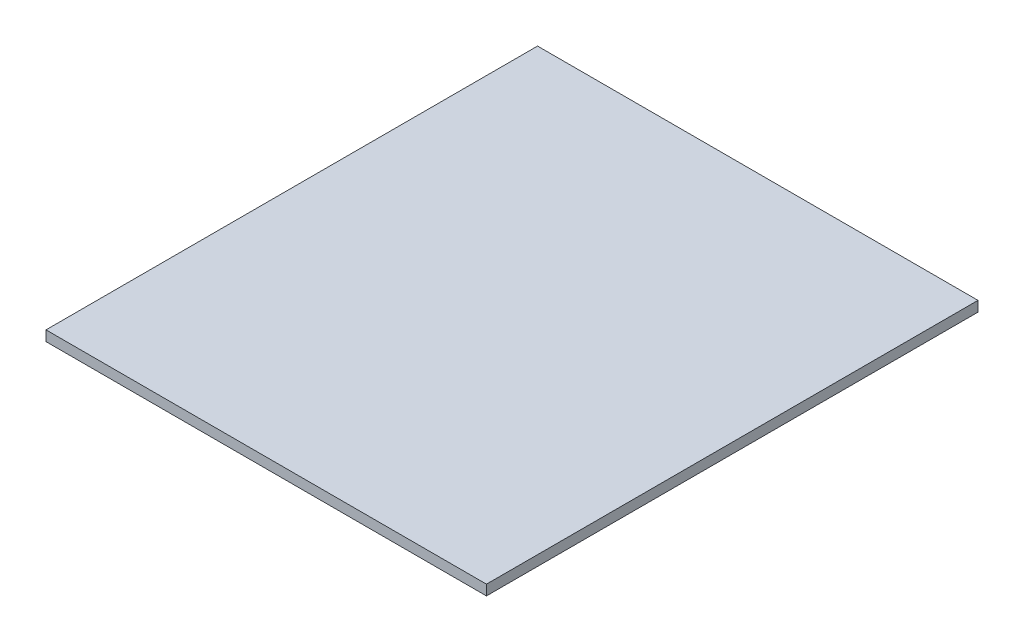
ISO-10303-21;
HEADER;
FILE_DESCRIPTION(('STEP AP214'),'2;1');
FILE_NAME('part.step','',(''),(''),'','','');
FILE_SCHEMA(('AUTOMOTIVE_DESIGN { 1 0 10303 214 1 1 1 1 }'));
ENDSEC;
DATA;
#1=APPLICATION_CONTEXT('core data for automotive mechanical design processes');
#2=APPLICATION_PROTOCOL_DEFINITION('international standard','automotive_design',2000,#1);
#3=PRODUCT_CONTEXT('',#1,'mechanical');
#4=PRODUCT('Part','Part','',(#3));
#5=PRODUCT_RELATED_PRODUCT_CATEGORY('part','',(#4));
#6=PRODUCT_DEFINITION_FORMATION('','',#4);
#7=PRODUCT_DEFINITION_CONTEXT('part definition',#1,'design');
#8=PRODUCT_DEFINITION('design','',#6,#7);
#9=PRODUCT_DEFINITION_SHAPE('','',#8);
#10=(LENGTH_UNIT() NAMED_UNIT(*) SI_UNIT(.MILLI.,.METRE.));
#11=(NAMED_UNIT(*) PLANE_ANGLE_UNIT() SI_UNIT($,.RADIAN.));
#12=(NAMED_UNIT(*) SI_UNIT($,.STERADIAN.) SOLID_ANGLE_UNIT());
#13=UNCERTAINTY_MEASURE_WITH_UNIT(LENGTH_MEASURE(1.E-05),#10,'distance_accuracy_value','');
#14=(GEOMETRIC_REPRESENTATION_CONTEXT(3) GLOBAL_UNCERTAINTY_ASSIGNED_CONTEXT((#13)) GLOBAL_UNIT_ASSIGNED_CONTEXT((#10,
#11,#12)) REPRESENTATION_CONTEXT('',''));
#15=CARTESIAN_POINT('',(0.,0.,0.));
#16=DIRECTION('',(0.,0.,1.));
#17=DIRECTION('',(1.,0.,0.));
#18=AXIS2_PLACEMENT_3D('',#15,#16,#17);
#19=CARTESIAN_POINT('',(172.4,4.,-192.4));
#20=DIRECTION('',(-1.,0.,0.));
#21=DIRECTION('',(0.,0.,1.));
#22=AXIS2_PLACEMENT_3D('',#19,#20,#21);
#23=PLANE('',#22);
#24=DIRECTION('',(0.,0.,-1.));
#25=VECTOR('',#24,1.);
#26=CARTESIAN_POINT('',(172.4,-4.,-192.4));
#27=LINE('',#26,#25);
#28=CARTESIAN_POINT('',(172.4,-4.,192.4));
#29=VERTEX_POINT('',#28);
#30=CARTESIAN_POINT('',(172.4,-4.,-192.4));
#31=VERTEX_POINT('',#30);
#32=EDGE_CURVE('E106',#29,#31,#27,.T.);
#33=ORIENTED_EDGE('',*,*,#32,.T.);
#34=DIRECTION('',(0.,-1.,0.));
#35=VECTOR('',#34,1.);
#36=CARTESIAN_POINT('',(172.4,4.,-192.4));
#37=LINE('',#36,#35);
#38=CARTESIAN_POINT('',(172.4,4.,-192.4));
#39=VERTEX_POINT('',#38);
#40=EDGE_CURVE('E11',#39,#31,#37,.T.);
#41=ORIENTED_EDGE('',*,*,#40,.F.);
#42=DIRECTION('',(0.,0.,-1.));
#43=VECTOR('',#42,1.);
#44=CARTESIAN_POINT('',(172.4,4.,-192.4));
#45=LINE('',#44,#43);
#46=CARTESIAN_POINT('',(172.4,4.,192.4));
#47=VERTEX_POINT('',#46);
#48=EDGE_CURVE('E94',#47,#39,#45,.T.);
#49=ORIENTED_EDGE('',*,*,#48,.F.);
#50=DIRECTION('',(0.,-1.,0.));
#51=VECTOR('',#50,1.);
#52=CARTESIAN_POINT('',(172.4,4.,192.4));
#53=LINE('',#52,#51);
#54=EDGE_CURVE('E102',#47,#29,#53,.T.);
#55=ORIENTED_EDGE('',*,*,#54,.T.);
#56=EDGE_LOOP('',(#33,#41,#49,#55));
#57=FACE_BOUND('',#56,.T.);
#58=ADVANCED_FACE('F43',(#57),#23,.F.);
#59=CARTESIAN_POINT('',(-172.4,4.,-192.4));
#60=DIRECTION('',(0.,0.,1.));
#61=DIRECTION('',(1.,0.,0.));
#62=AXIS2_PLACEMENT_3D('',#59,#60,#61);
#63=PLANE('',#62);
#64=DIRECTION('',(-1.,0.,0.));
#65=VECTOR('',#64,1.);
#66=CARTESIAN_POINT('',(-172.4,-4.,-192.4));
#67=LINE('',#66,#65);
#68=CARTESIAN_POINT('',(-172.4,-4.,-192.4));
#69=VERTEX_POINT('',#68);
#70=EDGE_CURVE('E98',#31,#69,#67,.T.);
#71=ORIENTED_EDGE('',*,*,#70,.T.);
#72=DIRECTION('',(0.,-1.,0.));
#73=VECTOR('',#72,1.);
#74=CARTESIAN_POINT('',(-172.4,4.,-192.4));
#75=LINE('',#74,#73);
#76=CARTESIAN_POINT('',(-172.4,4.,-192.4));
#77=VERTEX_POINT('',#76);
#78=EDGE_CURVE('E51',#77,#69,#75,.T.);
#79=ORIENTED_EDGE('',*,*,#78,.F.);
#80=DIRECTION('',(-1.,0.,0.));
#81=VECTOR('',#80,1.);
#82=CARTESIAN_POINT('',(-172.4,4.,-192.4));
#83=LINE('',#82,#81);
#84=EDGE_CURVE('E89',#39,#77,#83,.T.);
#85=ORIENTED_EDGE('',*,*,#84,.F.);
#86=ORIENTED_EDGE('',*,*,#40,.T.);
#87=EDGE_LOOP('',(#71,#79,#85,#86));
#88=FACE_BOUND('',#87,.T.);
#89=ADVANCED_FACE('F97',(#88),#63,.F.);
#90=CARTESIAN_POINT('',(-172.4,4.,-192.4));
#91=DIRECTION('',(1.,0.,0.));
#92=DIRECTION('',(0.,0.,-1.));
#93=AXIS2_PLACEMENT_3D('',#90,#91,#92);
#94=PLANE('',#93);
#95=DIRECTION('',(0.,0.,1.));
#96=VECTOR('',#95,1.);
#97=CARTESIAN_POINT('',(-172.4,-4.,-192.4));
#98=LINE('',#97,#96);
#99=CARTESIAN_POINT('',(-172.4,-4.,192.4));
#100=VERTEX_POINT('',#99);
#101=EDGE_CURVE('E76',#69,#100,#98,.T.);
#102=ORIENTED_EDGE('',*,*,#101,.T.);
#103=DIRECTION('',(0.,-1.,0.));
#104=VECTOR('',#103,1.);
#105=CARTESIAN_POINT('',(-172.4,4.,192.4));
#106=LINE('',#105,#104);
#107=CARTESIAN_POINT('',(-172.4,4.,192.4));
#108=VERTEX_POINT('',#107);
#109=EDGE_CURVE('E99',#108,#100,#106,.T.);
#110=ORIENTED_EDGE('',*,*,#109,.F.);
#111=DIRECTION('',(0.,0.,1.));
#112=VECTOR('',#111,1.);
#113=CARTESIAN_POINT('',(-172.4,4.,-192.4));
#114=LINE('',#113,#112);
#115=EDGE_CURVE('E92',#77,#108,#114,.T.);
#116=ORIENTED_EDGE('',*,*,#115,.F.);
#117=ORIENTED_EDGE('',*,*,#78,.T.);
#118=EDGE_LOOP('',(#102,#110,#116,#117));
#119=FACE_BOUND('',#118,.T.);
#120=ADVANCED_FACE('F100',(#119),#94,.F.);
#121=CARTESIAN_POINT('',(-172.4,4.,192.4));
#122=DIRECTION('',(0.,0.,-1.));
#123=DIRECTION('',(-1.,0.,0.));
#124=AXIS2_PLACEMENT_3D('',#121,#122,#123);
#125=PLANE('',#124);
#126=DIRECTION('',(1.,0.,0.));
#127=VECTOR('',#126,1.);
#128=CARTESIAN_POINT('',(-172.4,-4.,192.4));
#129=LINE('',#128,#127);
#130=EDGE_CURVE('E82',#100,#29,#129,.T.);
#131=ORIENTED_EDGE('',*,*,#130,.T.);
#132=ORIENTED_EDGE('',*,*,#54,.F.);
#133=DIRECTION('',(1.,0.,0.));
#134=VECTOR('',#133,1.);
#135=CARTESIAN_POINT('',(-172.4,4.,192.4));
#136=LINE('',#135,#134);
#137=EDGE_CURVE('E59',#108,#47,#136,.T.);
#138=ORIENTED_EDGE('',*,*,#137,.F.);
#139=ORIENTED_EDGE('',*,*,#109,.T.);
#140=EDGE_LOOP('',(#131,#132,#138,#139));
#141=FACE_BOUND('',#140,.T.);
#142=ADVANCED_FACE('F113',(#141),#125,.F.);
#143=CARTESIAN_POINT('',(0.,4.,0.));
#144=DIRECTION('',(0.,1.,0.));
#145=DIRECTION('',(0.,0.,1.));
#146=AXIS2_PLACEMENT_3D('',#143,#144,#145);
#147=PLANE('',#146);
#148=ORIENTED_EDGE('',*,*,#48,.T.);
#149=ORIENTED_EDGE('',*,*,#84,.T.);
#150=ORIENTED_EDGE('',*,*,#115,.T.);
#151=ORIENTED_EDGE('',*,*,#137,.T.);
#152=EDGE_LOOP('',(#148,#149,#150,#151));
#153=FACE_BOUND('',#152,.T.);
#154=ADVANCED_FACE('F90',(#153),#147,.T.);
#155=CARTESIAN_POINT('',(0.,-4.,0.));
#156=DIRECTION('',(0.,1.,0.));
#157=DIRECTION('',(0.,0.,1.));
#158=AXIS2_PLACEMENT_3D('',#155,#156,#157);
#159=PLANE('',#158);
#160=ORIENTED_EDGE('',*,*,#32,.F.);
#161=ORIENTED_EDGE('',*,*,#130,.F.);
#162=ORIENTED_EDGE('',*,*,#101,.F.);
#163=ORIENTED_EDGE('',*,*,#70,.F.);
#164=EDGE_LOOP('',(#160,#161,#162,#163));
#165=FACE_BOUND('',#164,.T.);
#166=ADVANCED_FACE('F116',(#165),#159,.F.);
#167=CLOSED_SHELL('',(#58,#89,#120,#142,#154,#166));
#168=MANIFOLD_SOLID_BREP('B2',#167);
#169=ADVANCED_BREP_SHAPE_REPRESENTATION('',(#18,#168),#14);
#170=SHAPE_DEFINITION_REPRESENTATION(#9,#169);
ENDSEC;
END-ISO-10303-21;
